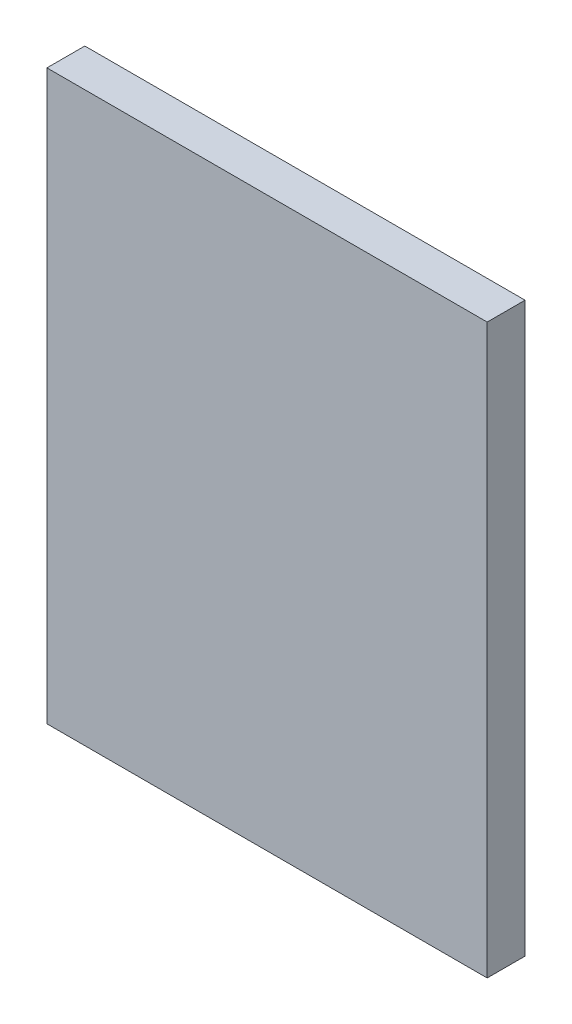
ISO-10303-21;
HEADER;
FILE_DESCRIPTION(('STEP AP214'),'2;1');
FILE_NAME('part.step','',(''),(''),'','','');
FILE_SCHEMA(('AUTOMOTIVE_DESIGN { 1 0 10303 214 1 1 1 1 }'));
ENDSEC;
DATA;
#1=APPLICATION_CONTEXT('core data for automotive mechanical design processes');
#2=APPLICATION_PROTOCOL_DEFINITION('international standard','automotive_design',2000,#1);
#3=PRODUCT_CONTEXT('',#1,'mechanical');
#4=PRODUCT('Part','Part','',(#3));
#5=PRODUCT_RELATED_PRODUCT_CATEGORY('part','',(#4));
#6=PRODUCT_DEFINITION_FORMATION('','',#4);
#7=PRODUCT_DEFINITION_CONTEXT('part definition',#1,'design');
#8=PRODUCT_DEFINITION('design','',#6,#7);
#9=PRODUCT_DEFINITION_SHAPE('','',#8);
#10=(LENGTH_UNIT() NAMED_UNIT(*) SI_UNIT(.MILLI.,.METRE.));
#11=(NAMED_UNIT(*) PLANE_ANGLE_UNIT() SI_UNIT($,.RADIAN.));
#12=(NAMED_UNIT(*) SI_UNIT($,.STERADIAN.) SOLID_ANGLE_UNIT());
#13=UNCERTAINTY_MEASURE_WITH_UNIT(LENGTH_MEASURE(1.E-05),#10,'distance_accuracy_value','');
#14=(GEOMETRIC_REPRESENTATION_CONTEXT(3) GLOBAL_UNCERTAINTY_ASSIGNED_CONTEXT((#13)) GLOBAL_UNIT_ASSIGNED_CONTEXT((#10,
#11,#12)) REPRESENTATION_CONTEXT('',''));
#15=CARTESIAN_POINT('',(0.,0.,0.));
#16=DIRECTION('',(0.,0.,1.));
#17=DIRECTION('',(1.,0.,0.));
#18=AXIS2_PLACEMENT_3D('',#15,#16,#17);
#19=CARTESIAN_POINT('',(-46.5,-60.,8.));
#20=DIRECTION('',(1.,0.,0.));
#21=DIRECTION('',(0.,0.,-1.));
#22=AXIS2_PLACEMENT_3D('',#19,#20,#21);
#23=PLANE('',#22);
#24=DIRECTION('',(0.,-1.,0.));
#25=VECTOR('',#24,1.);
#26=CARTESIAN_POINT('',(-46.5,-60.,0.));
#27=LINE('',#26,#25);
#28=CARTESIAN_POINT('',(-46.5,60.,0.));
#29=VERTEX_POINT('',#28);
#30=CARTESIAN_POINT('',(-46.5,-60.,0.));
#31=VERTEX_POINT('',#30);
#32=EDGE_CURVE('E113',#29,#31,#27,.T.);
#33=ORIENTED_EDGE('',*,*,#32,.T.);
#34=DIRECTION('',(0.,0.,-1.));
#35=VECTOR('',#34,1.);
#36=CARTESIAN_POINT('',(-46.5,-60.,8.));
#37=LINE('',#36,#35);
#38=CARTESIAN_POINT('',(-46.5,-60.,8.));
#39=VERTEX_POINT('',#38);
#40=EDGE_CURVE('E11',#39,#31,#37,.T.);
#41=ORIENTED_EDGE('',*,*,#40,.F.);
#42=DIRECTION('',(0.,-1.,0.));
#43=VECTOR('',#42,1.);
#44=CARTESIAN_POINT('',(-46.5,-60.,8.));
#45=LINE('',#44,#43);
#46=CARTESIAN_POINT('',(-46.5,60.,8.));
#47=VERTEX_POINT('',#46);
#48=EDGE_CURVE('E97',#47,#39,#45,.T.);
#49=ORIENTED_EDGE('',*,*,#48,.F.);
#50=DIRECTION('',(0.,0.,-1.));
#51=VECTOR('',#50,1.);
#52=CARTESIAN_POINT('',(-46.5,60.,8.));
#53=LINE('',#52,#51);
#54=EDGE_CURVE('E109',#47,#29,#53,.T.);
#55=ORIENTED_EDGE('',*,*,#54,.T.);
#56=EDGE_LOOP('',(#33,#41,#49,#55));
#57=FACE_BOUND('',#56,.T.);
#58=ADVANCED_FACE('F45',(#57),#23,.F.);
#59=CARTESIAN_POINT('',(46.5,-60.,8.));
#60=DIRECTION('',(0.,1.,0.));
#61=DIRECTION('',(-1.,0.,0.));
#62=AXIS2_PLACEMENT_3D('',#59,#60,#61);
#63=PLANE('',#62);
#64=DIRECTION('',(1.,0.,0.));
#65=VECTOR('',#64,1.);
#66=CARTESIAN_POINT('',(46.5,-60.,0.));
#67=LINE('',#66,#65);
#68=CARTESIAN_POINT('',(46.5,-60.,0.));
#69=VERTEX_POINT('',#68);
#70=EDGE_CURVE('E102',#31,#69,#67,.T.);
#71=ORIENTED_EDGE('',*,*,#70,.T.);
#72=DIRECTION('',(0.,0.,-1.));
#73=VECTOR('',#72,1.);
#74=CARTESIAN_POINT('',(46.5,-60.,8.));
#75=LINE('',#74,#73);
#76=CARTESIAN_POINT('',(46.5,-60.,8.));
#77=VERTEX_POINT('',#76);
#78=EDGE_CURVE('E54',#77,#69,#75,.T.);
#79=ORIENTED_EDGE('',*,*,#78,.F.);
#80=DIRECTION('',(1.,0.,0.));
#81=VECTOR('',#80,1.);
#82=CARTESIAN_POINT('',(46.5,-60.,8.));
#83=LINE('',#82,#81);
#84=EDGE_CURVE('E92',#39,#77,#83,.T.);
#85=ORIENTED_EDGE('',*,*,#84,.F.);
#86=ORIENTED_EDGE('',*,*,#40,.T.);
#87=EDGE_LOOP('',(#71,#79,#85,#86));
#88=FACE_BOUND('',#87,.T.);
#89=ADVANCED_FACE('F101',(#88),#63,.F.);
#90=CARTESIAN_POINT('',(46.5,-60.,8.));
#91=DIRECTION('',(-1.,0.,0.));
#92=DIRECTION('',(0.,0.,1.));
#93=AXIS2_PLACEMENT_3D('',#90,#91,#92);
#94=PLANE('',#93);
#95=DIRECTION('',(0.,1.,0.));
#96=VECTOR('',#95,1.);
#97=CARTESIAN_POINT('',(46.5,-60.,0.));
#98=LINE('',#97,#96);
#99=CARTESIAN_POINT('',(46.5,60.,0.));
#100=VERTEX_POINT('',#99);
#101=EDGE_CURVE('E79',#69,#100,#98,.T.);
#102=ORIENTED_EDGE('',*,*,#101,.T.);
#103=DIRECTION('',(0.,0.,-1.));
#104=VECTOR('',#103,1.);
#105=CARTESIAN_POINT('',(46.5,60.,8.));
#106=LINE('',#105,#104);
#107=CARTESIAN_POINT('',(46.5,60.,8.));
#108=VERTEX_POINT('',#107);
#109=EDGE_CURVE('E104',#108,#100,#106,.T.);
#110=ORIENTED_EDGE('',*,*,#109,.F.);
#111=DIRECTION('',(0.,1.,0.));
#112=VECTOR('',#111,1.);
#113=CARTESIAN_POINT('',(46.5,-60.,8.));
#114=LINE('',#113,#112);
#115=EDGE_CURVE('E95',#77,#108,#114,.T.);
#116=ORIENTED_EDGE('',*,*,#115,.F.);
#117=ORIENTED_EDGE('',*,*,#78,.T.);
#118=EDGE_LOOP('',(#102,#110,#116,#117));
#119=FACE_BOUND('',#118,.T.);
#120=ADVANCED_FACE('F105',(#119),#94,.F.);
#121=CARTESIAN_POINT('',(46.5,60.,8.));
#122=DIRECTION('',(0.,-1.,0.));
#123=DIRECTION('',(1.,0.,0.));
#124=AXIS2_PLACEMENT_3D('',#121,#122,#123);
#125=PLANE('',#124);
#126=DIRECTION('',(-1.,0.,0.));
#127=VECTOR('',#126,1.);
#128=CARTESIAN_POINT('',(46.5,60.,0.));
#129=LINE('',#128,#127);
#130=EDGE_CURVE('E85',#100,#29,#129,.T.);
#131=ORIENTED_EDGE('',*,*,#130,.T.);
#132=ORIENTED_EDGE('',*,*,#54,.F.);
#133=DIRECTION('',(-1.,0.,0.));
#134=VECTOR('',#133,1.);
#135=CARTESIAN_POINT('',(46.5,60.,8.));
#136=LINE('',#135,#134);
#137=EDGE_CURVE('E62',#108,#47,#136,.T.);
#138=ORIENTED_EDGE('',*,*,#137,.F.);
#139=ORIENTED_EDGE('',*,*,#109,.T.);
#140=EDGE_LOOP('',(#131,#132,#138,#139));
#141=FACE_BOUND('',#140,.T.);
#142=ADVANCED_FACE('F126',(#141),#125,.F.);
#143=CARTESIAN_POINT('',(0.,0.,8.));
#144=DIRECTION('',(0.,0.,1.));
#145=DIRECTION('',(1.,0.,0.));
#146=AXIS2_PLACEMENT_3D('',#143,#144,#145);
#147=PLANE('',#146);
#148=ORIENTED_EDGE('',*,*,#48,.T.);
#149=ORIENTED_EDGE('',*,*,#84,.T.);
#150=ORIENTED_EDGE('',*,*,#115,.T.);
#151=ORIENTED_EDGE('',*,*,#137,.T.);
#152=EDGE_LOOP('',(#148,#149,#150,#151));
#153=FACE_BOUND('',#152,.T.);
#154=ADVANCED_FACE('F93',(#153),#147,.T.);
#155=CARTESIAN_POINT('',(0.,0.,0.));
#156=DIRECTION('',(0.,0.,1.));
#157=DIRECTION('',(1.,0.,0.));
#158=AXIS2_PLACEMENT_3D('',#155,#156,#157);
#159=PLANE('',#158);
#160=ORIENTED_EDGE('',*,*,#32,.F.);
#161=ORIENTED_EDGE('',*,*,#130,.F.);
#162=ORIENTED_EDGE('',*,*,#101,.F.);
#163=ORIENTED_EDGE('',*,*,#70,.F.);
#164=EDGE_LOOP('',(#160,#161,#162,#163));
#165=FACE_BOUND('',#164,.T.);
#166=ADVANCED_FACE('F129',(#165),#159,.F.);
#167=CLOSED_SHELL('',(#58,#89,#120,#142,#154,#166));
#168=MANIFOLD_SOLID_BREP('B2',#167);
#169=ADVANCED_BREP_SHAPE_REPRESENTATION('',(#18,#168),#14);
#170=SHAPE_DEFINITION_REPRESENTATION(#9,#169);
ENDSEC;
END-ISO-10303-21;
